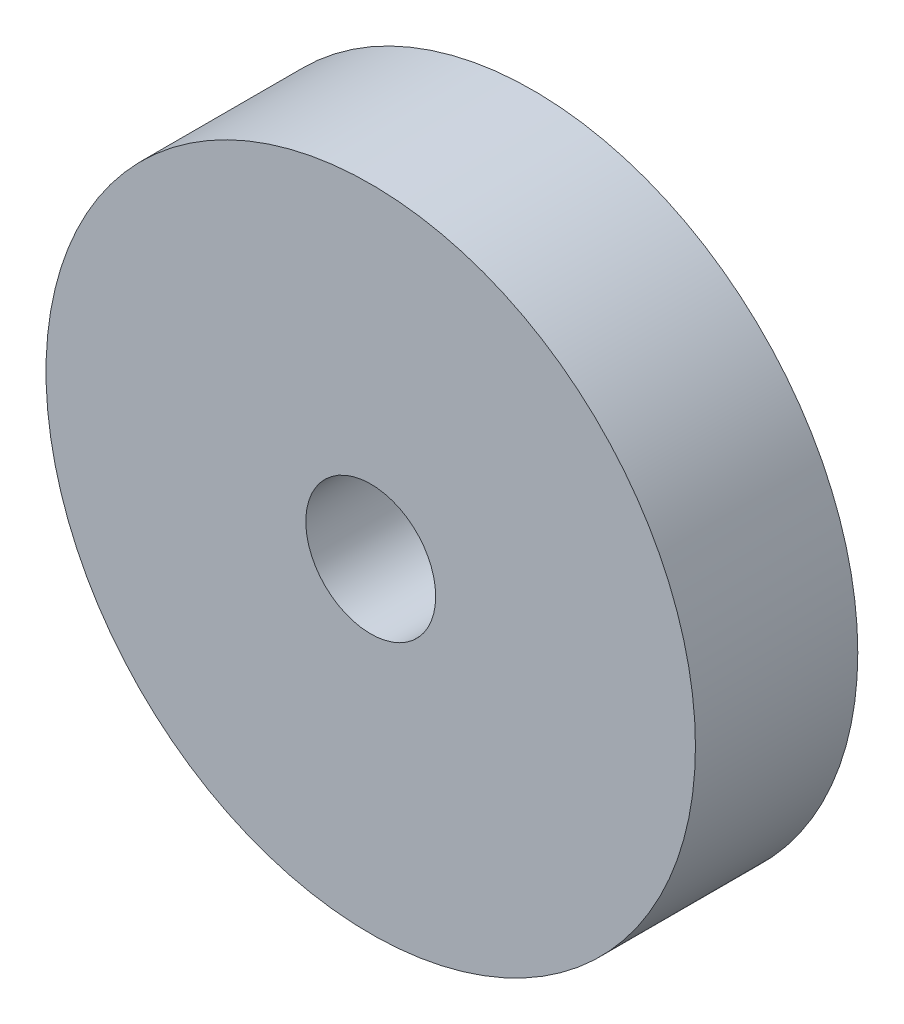
ISO-10303-21;
HEADER;
FILE_DESCRIPTION(('STEP AP214'),'2;1');
FILE_NAME('part.step','',(''),(''),'','','');
FILE_SCHEMA(('AUTOMOTIVE_DESIGN { 1 0 10303 214 1 1 1 1 }'));
ENDSEC;
DATA;
#1=APPLICATION_CONTEXT('core data for automotive mechanical design processes');
#2=APPLICATION_PROTOCOL_DEFINITION('international standard','automotive_design',2000,#1);
#3=PRODUCT_CONTEXT('',#1,'mechanical');
#4=PRODUCT('Part','Part','',(#3));
#5=PRODUCT_RELATED_PRODUCT_CATEGORY('part','',(#4));
#6=PRODUCT_DEFINITION_FORMATION('','',#4);
#7=PRODUCT_DEFINITION_CONTEXT('part definition',#1,'design');
#8=PRODUCT_DEFINITION('design','',#6,#7);
#9=PRODUCT_DEFINITION_SHAPE('','',#8);
#10=(LENGTH_UNIT() NAMED_UNIT(*) SI_UNIT(.MILLI.,.METRE.));
#11=(NAMED_UNIT(*) PLANE_ANGLE_UNIT() SI_UNIT($,.RADIAN.));
#12=(NAMED_UNIT(*) SI_UNIT($,.STERADIAN.) SOLID_ANGLE_UNIT());
#13=UNCERTAINTY_MEASURE_WITH_UNIT(LENGTH_MEASURE(1.E-05),#10,'distance_accuracy_value','');
#14=(GEOMETRIC_REPRESENTATION_CONTEXT(3) GLOBAL_UNCERTAINTY_ASSIGNED_CONTEXT((#13)) GLOBAL_UNIT_ASSIGNED_CONTEXT((#10,
#11,#12)) REPRESENTATION_CONTEXT('',''));
#15=CARTESIAN_POINT('',(0.,0.,0.));
#16=DIRECTION('',(0.,0.,1.));
#17=DIRECTION('',(1.,0.,0.));
#18=AXIS2_PLACEMENT_3D('',#15,#16,#17);
#19=CARTESIAN_POINT('',(0.,280.,10.));
#20=DIRECTION('',(0.,0.,-1.));
#21=DIRECTION('',(-1.,0.,0.));
#22=AXIS2_PLACEMENT_3D('',#19,#20,#21);
#23=CYLINDRICAL_SURFACE('',#22,20.);
#24=CARTESIAN_POINT('',(0.,280.,10.));
#25=DIRECTION('',(0.,0.,1.));
#26=DIRECTION('',(1.,0.,0.));
#27=AXIS2_PLACEMENT_3D('',#24,#25,#26);
#28=CIRCLE('',#27,20.);
#29=CARTESIAN_POINT('',(20.,280.,10.));
#30=VERTEX_POINT('',#29);
#31=EDGE_CURVE('E10',#30,#30,#28,.T.);
#32=ORIENTED_EDGE('',*,*,#31,.F.);
#33=EDGE_LOOP('',(#32));
#34=FACE_BOUND('',#33,.T.);
#35=CARTESIAN_POINT('',(0.,280.,0.));
#36=DIRECTION('',(0.,0.,1.));
#37=DIRECTION('',(1.,0.,0.));
#38=AXIS2_PLACEMENT_3D('',#35,#36,#37);
#39=CIRCLE('',#38,20.);
#40=CARTESIAN_POINT('',(20.,280.,0.));
#41=VERTEX_POINT('',#40);
#42=EDGE_CURVE('E34',#41,#41,#39,.T.);
#43=ORIENTED_EDGE('',*,*,#42,.T.);
#44=EDGE_LOOP('',(#43));
#45=FACE_BOUND('',#44,.T.);
#46=ADVANCED_FACE('F31',(#34,#45),#23,.T.);
#47=CARTESIAN_POINT('',(0.,280.,10.));
#48=DIRECTION('',(0.,0.,1.));
#49=DIRECTION('',(1.,0.,0.));
#50=AXIS2_PLACEMENT_3D('',#47,#48,#49);
#51=PLANE('',#50);
#52=CARTESIAN_POINT('',(0.,280.,10.));
#53=DIRECTION('',(0.,0.,1.));
#54=DIRECTION('',(1.,0.,0.));
#55=AXIS2_PLACEMENT_3D('',#52,#53,#54);
#56=CIRCLE('',#55,4.);
#57=CARTESIAN_POINT('',(4.,280.,10.));
#58=VERTEX_POINT('',#57);
#59=EDGE_CURVE('E43',#58,#58,#56,.T.);
#60=ORIENTED_EDGE('',*,*,#59,.F.);
#61=EDGE_LOOP('',(#60));
#62=FACE_BOUND('',#61,.T.);
#63=ORIENTED_EDGE('',*,*,#31,.T.);
#64=EDGE_LOOP('',(#63));
#65=FACE_BOUND('',#64,.T.);
#66=ADVANCED_FACE('F58',(#62,#65),#51,.T.);
#67=CARTESIAN_POINT('',(0.,280.,0.));
#68=DIRECTION('',(0.,0.,1.));
#69=DIRECTION('',(1.,0.,0.));
#70=AXIS2_PLACEMENT_3D('',#67,#68,#69);
#71=PLANE('',#70);
#72=CARTESIAN_POINT('',(0.,280.,0.));
#73=DIRECTION('',(0.,0.,1.));
#74=DIRECTION('',(1.,0.,0.));
#75=AXIS2_PLACEMENT_3D('',#72,#73,#74);
#76=CIRCLE('',#75,4.);
#77=CARTESIAN_POINT('',(4.,280.,0.));
#78=VERTEX_POINT('',#77);
#79=EDGE_CURVE('E41',#78,#78,#76,.T.);
#80=ORIENTED_EDGE('',*,*,#79,.T.);
#81=EDGE_LOOP('',(#80));
#82=FACE_BOUND('',#81,.T.);
#83=ORIENTED_EDGE('',*,*,#42,.F.);
#84=EDGE_LOOP('',(#83));
#85=FACE_BOUND('',#84,.T.);
#86=ADVANCED_FACE('F49',(#82,#85),#71,.F.);
#87=CARTESIAN_POINT('',(0.,280.,0.));
#88=DIRECTION('',(0.,0.,1.));
#89=DIRECTION('',(1.,0.,0.));
#90=AXIS2_PLACEMENT_3D('',#87,#88,#89);
#91=CYLINDRICAL_SURFACE('',#90,4.);
#92=ORIENTED_EDGE('',*,*,#79,.F.);
#93=EDGE_LOOP('',(#92));
#94=FACE_BOUND('',#93,.T.);
#95=ORIENTED_EDGE('',*,*,#59,.T.);
#96=EDGE_LOOP('',(#95));
#97=FACE_BOUND('',#96,.T.);
#98=ADVANCED_FACE('F52',(#94,#97),#91,.F.);
#99=CLOSED_SHELL('',(#46,#66,#86,#98));
#100=MANIFOLD_SOLID_BREP('B2',#99);
#101=ADVANCED_BREP_SHAPE_REPRESENTATION('',(#18,#100),#14);
#102=SHAPE_DEFINITION_REPRESENTATION(#9,#101);
ENDSEC;
END-ISO-10303-21;
